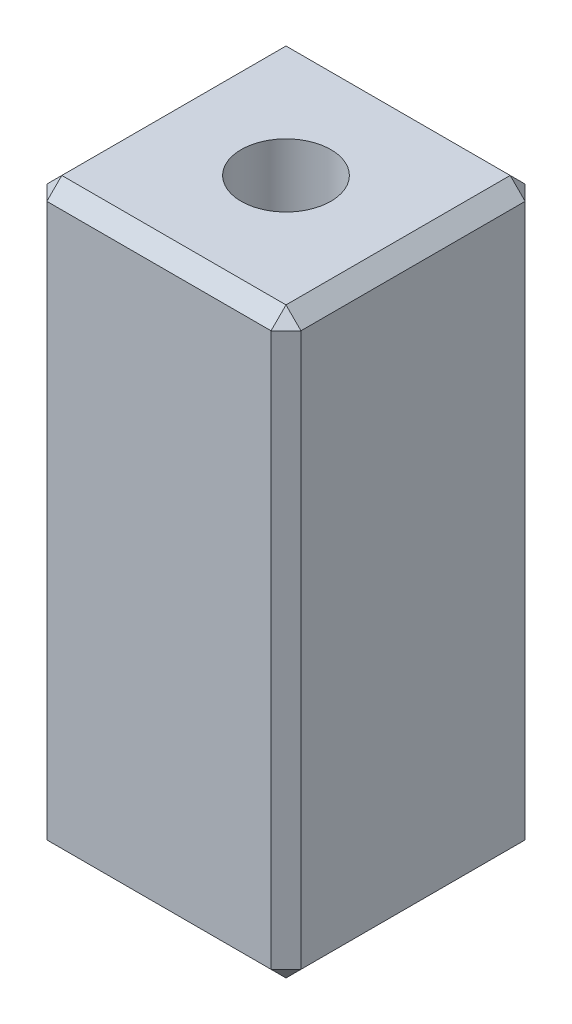
ISO-10303-21;
HEADER;
FILE_DESCRIPTION(('STEP AP214'),'2;1');
FILE_NAME('part.step','',(''),(''),'','','');
FILE_SCHEMA(('AUTOMOTIVE_DESIGN { 1 0 10303 214 1 1 1 1 }'));
ENDSEC;
DATA;
#1=APPLICATION_CONTEXT('core data for automotive mechanical design processes');
#2=APPLICATION_PROTOCOL_DEFINITION('international standard','automotive_design',2000,#1);
#3=PRODUCT_CONTEXT('',#1,'mechanical');
#4=PRODUCT('Part','Part','',(#3));
#5=PRODUCT_RELATED_PRODUCT_CATEGORY('part','',(#4));
#6=PRODUCT_DEFINITION_FORMATION('','',#4);
#7=PRODUCT_DEFINITION_CONTEXT('part definition',#1,'design');
#8=PRODUCT_DEFINITION('design','',#6,#7);
#9=PRODUCT_DEFINITION_SHAPE('','',#8);
#10=(LENGTH_UNIT() NAMED_UNIT(*) SI_UNIT(.MILLI.,.METRE.));
#11=(NAMED_UNIT(*) PLANE_ANGLE_UNIT() SI_UNIT($,.RADIAN.));
#12=(NAMED_UNIT(*) SI_UNIT($,.STERADIAN.) SOLID_ANGLE_UNIT());
#13=UNCERTAINTY_MEASURE_WITH_UNIT(LENGTH_MEASURE(1.E-05),#10,'distance_accuracy_value','');
#14=(GEOMETRIC_REPRESENTATION_CONTEXT(3) GLOBAL_UNCERTAINTY_ASSIGNED_CONTEXT((#13)) GLOBAL_UNIT_ASSIGNED_CONTEXT((#10,
#11,#12)) REPRESENTATION_CONTEXT('',''));
#15=CARTESIAN_POINT('',(0.,0.,0.));
#16=DIRECTION('',(0.,0.,1.));
#17=DIRECTION('',(1.,0.,0.));
#18=AXIS2_PLACEMENT_3D('',#15,#16,#17);
#19=CARTESIAN_POINT('',(0.,19.5,0.));
#20=DIRECTION('',(0.,1.,0.));
#21=DIRECTION('',(0.,0.,1.));
#22=AXIS2_PLACEMENT_3D('',#19,#20,#21);
#23=PLANE('',#22);
#24=DIRECTION('',(-1.,0.,0.));
#25=VECTOR('',#24,1.);
#26=CARTESIAN_POINT('',(-4.25,19.5,-3.75));
#27=LINE('',#26,#25);
#28=CARTESIAN_POINT('',(3.75,19.5,-3.75));
#29=VERTEX_POINT('',#28);
#30=CARTESIAN_POINT('',(-3.75,19.5,-3.75));
#31=VERTEX_POINT('',#30);
#32=EDGE_CURVE('E51',#29,#31,#27,.T.);
#33=ORIENTED_EDGE('',*,*,#32,.T.);
#34=DIRECTION('',(0.,0.,1.));
#35=VECTOR('',#34,1.);
#36=CARTESIAN_POINT('',(-3.75,19.5,4.25));
#37=LINE('',#36,#35);
#38=CARTESIAN_POINT('',(-3.75,19.5,3.75));
#39=VERTEX_POINT('',#38);
#40=EDGE_CURVE('E11',#31,#39,#37,.T.);
#41=ORIENTED_EDGE('',*,*,#40,.T.);
#42=DIRECTION('',(1.,0.,0.));
#43=VECTOR('',#42,1.);
#44=CARTESIAN_POINT('',(4.25,19.5,3.75));
#45=LINE('',#44,#43);
#46=CARTESIAN_POINT('',(3.75,19.5,3.75));
#47=VERTEX_POINT('',#46);
#48=EDGE_CURVE('E258',#39,#47,#45,.T.);
#49=ORIENTED_EDGE('',*,*,#48,.T.);
#50=DIRECTION('',(0.,0.,-1.));
#51=VECTOR('',#50,1.);
#52=CARTESIAN_POINT('',(3.75,19.5,-4.25));
#53=LINE('',#52,#51);
#54=EDGE_CURVE('E62',#47,#29,#53,.T.);
#55=ORIENTED_EDGE('',*,*,#54,.T.);
#56=EDGE_LOOP('',(#33,#41,#49,#55));
#57=FACE_BOUND('',#56,.T.);
#58=CARTESIAN_POINT('',(0.,19.5,0.));
#59=DIRECTION('',(0.,1.,0.));
#60=DIRECTION('',(0.,0.,1.));
#61=AXIS2_PLACEMENT_3D('',#58,#59,#60);
#62=CIRCLE('',#61,1.5);
#63=CARTESIAN_POINT('',(0.,19.5,1.5));
#64=VERTEX_POINT('',#63);
#65=EDGE_CURVE('E152',#64,#64,#62,.T.);
#66=ORIENTED_EDGE('',*,*,#65,.F.);
#67=EDGE_LOOP('',(#66));
#68=FACE_BOUND('',#67,.T.);
#69=ADVANCED_FACE('F41',(#57,#68),#23,.T.);
#70=CARTESIAN_POINT('',(0.,0.,0.));
#71=DIRECTION('',(0.,1.,0.));
#72=DIRECTION('',(0.,0.,1.));
#73=AXIS2_PLACEMENT_3D('',#70,#71,#72);
#74=PLANE('',#73);
#75=DIRECTION('',(-1.,0.,0.));
#76=VECTOR('',#75,1.);
#77=CARTESIAN_POINT('',(0.,0.,3.75));
#78=LINE('',#77,#76);
#79=CARTESIAN_POINT('',(3.75,0.,3.75));
#80=VERTEX_POINT('',#79);
#81=CARTESIAN_POINT('',(-3.75,0.,3.75));
#82=VERTEX_POINT('',#81);
#83=EDGE_CURVE('E223',#80,#82,#78,.T.);
#84=ORIENTED_EDGE('',*,*,#83,.T.);
#85=DIRECTION('',(0.,0.,-1.));
#86=VECTOR('',#85,1.);
#87=CARTESIAN_POINT('',(-3.75,0.,0.));
#88=LINE('',#87,#86);
#89=CARTESIAN_POINT('',(-3.75,0.,-3.75));
#90=VERTEX_POINT('',#89);
#91=EDGE_CURVE('E229',#82,#90,#88,.T.);
#92=ORIENTED_EDGE('',*,*,#91,.T.);
#93=DIRECTION('',(1.,0.,0.));
#94=VECTOR('',#93,1.);
#95=CARTESIAN_POINT('',(0.,0.,-3.75));
#96=LINE('',#95,#94);
#97=CARTESIAN_POINT('',(3.75,0.,-3.75));
#98=VERTEX_POINT('',#97);
#99=EDGE_CURVE('E227',#90,#98,#96,.T.);
#100=ORIENTED_EDGE('',*,*,#99,.T.);
#101=DIRECTION('',(0.,0.,1.));
#102=VECTOR('',#101,1.);
#103=CARTESIAN_POINT('',(3.75,0.,0.));
#104=LINE('',#103,#102);
#105=EDGE_CURVE('E225',#98,#80,#104,.T.);
#106=ORIENTED_EDGE('',*,*,#105,.T.);
#107=EDGE_LOOP('',(#84,#92,#100,#106));
#108=FACE_BOUND('',#107,.T.);
#109=CARTESIAN_POINT('',(0.,0.,0.));
#110=DIRECTION('',(0.,1.,0.));
#111=DIRECTION('',(0.,0.,1.));
#112=AXIS2_PLACEMENT_3D('',#109,#110,#111);
#113=CIRCLE('',#112,1.5);
#114=CARTESIAN_POINT('',(0.,0.,1.5));
#115=VERTEX_POINT('',#114);
#116=EDGE_CURVE('E210',#115,#115,#113,.T.);
#117=ORIENTED_EDGE('',*,*,#116,.T.);
#118=EDGE_LOOP('',(#117));
#119=FACE_BOUND('',#118,.T.);
#120=ADVANCED_FACE('F288',(#108,#119),#74,.F.);
#121=CARTESIAN_POINT('',(4.25,19.5,-4.25));
#122=DIRECTION('',(-1.,0.,0.));
#123=DIRECTION('',(0.,0.,1.));
#124=AXIS2_PLACEMENT_3D('',#121,#122,#123);
#125=PLANE('',#124);
#126=DIRECTION('',(0.,-1.,0.));
#127=VECTOR('',#126,1.);
#128=CARTESIAN_POINT('',(4.25,19.5,3.75));
#129=LINE('',#128,#127);
#130=CARTESIAN_POINT('',(4.25,19.,3.75));
#131=VERTEX_POINT('',#130);
#132=CARTESIAN_POINT('',(4.25,0.500000000000004,3.75));
#133=VERTEX_POINT('',#132);
#134=EDGE_CURVE('E241',#131,#133,#129,.T.);
#135=ORIENTED_EDGE('',*,*,#134,.T.);
#136=DIRECTION('',(0.,0.,-1.));
#137=VECTOR('',#136,1.);
#138=CARTESIAN_POINT('',(4.25,0.500000000000004,-4.25));
#139=LINE('',#138,#137);
#140=CARTESIAN_POINT('',(4.25,0.500000000000004,-3.75));
#141=VERTEX_POINT('',#140);
#142=EDGE_CURVE('E247',#133,#141,#139,.T.);
#143=ORIENTED_EDGE('',*,*,#142,.T.);
#144=DIRECTION('',(0.,1.,0.));
#145=VECTOR('',#144,1.);
#146=CARTESIAN_POINT('',(4.25,19.5,-3.75));
#147=LINE('',#146,#145);
#148=CARTESIAN_POINT('',(4.25,19.,-3.75));
#149=VERTEX_POINT('',#148);
#150=EDGE_CURVE('E245',#141,#149,#147,.T.);
#151=ORIENTED_EDGE('',*,*,#150,.T.);
#152=DIRECTION('',(0.,0.,1.));
#153=VECTOR('',#152,1.);
#154=CARTESIAN_POINT('',(4.25,19.,4.25));
#155=LINE('',#154,#153);
#156=EDGE_CURVE('E243',#149,#131,#155,.T.);
#157=ORIENTED_EDGE('',*,*,#156,.T.);
#158=EDGE_LOOP('',(#135,#143,#151,#157));
#159=FACE_BOUND('',#158,.T.);
#160=ADVANCED_FACE('F352',(#159),#125,.F.);
#161=CARTESIAN_POINT('',(-4.25,19.5,-4.25));
#162=DIRECTION('',(0.,0.,1.));
#163=DIRECTION('',(1.,0.,0.));
#164=AXIS2_PLACEMENT_3D('',#161,#162,#163);
#165=PLANE('',#164);
#166=DIRECTION('',(0.,-1.,0.));
#167=VECTOR('',#166,1.);
#168=CARTESIAN_POINT('',(3.75,19.5,-4.25));
#169=LINE('',#168,#167);
#170=CARTESIAN_POINT('',(3.75,19.,-4.25));
#171=VERTEX_POINT('',#170);
#172=CARTESIAN_POINT('',(3.75,0.500000000000004,-4.25));
#173=VERTEX_POINT('',#172);
#174=EDGE_CURVE('E234',#171,#173,#169,.T.);
#175=ORIENTED_EDGE('',*,*,#174,.T.);
#176=DIRECTION('',(-1.,0.,0.));
#177=VECTOR('',#176,1.);
#178=CARTESIAN_POINT('',(-4.25,0.500000000000004,-4.25));
#179=LINE('',#178,#177);
#180=CARTESIAN_POINT('',(-3.75,0.500000000000004,-4.25));
#181=VERTEX_POINT('',#180);
#182=EDGE_CURVE('E238',#173,#181,#179,.T.);
#183=ORIENTED_EDGE('',*,*,#182,.T.);
#184=DIRECTION('',(0.,1.,0.));
#185=VECTOR('',#184,1.);
#186=CARTESIAN_POINT('',(-3.75,19.5,-4.25));
#187=LINE('',#186,#185);
#188=CARTESIAN_POINT('',(-3.75,19.,-4.25));
#189=VERTEX_POINT('',#188);
#190=EDGE_CURVE('E236',#181,#189,#187,.T.);
#191=ORIENTED_EDGE('',*,*,#190,.T.);
#192=DIRECTION('',(1.,0.,0.));
#193=VECTOR('',#192,1.);
#194=CARTESIAN_POINT('',(4.25,19.,-4.25));
#195=LINE('',#194,#193);
#196=EDGE_CURVE('E232',#189,#171,#195,.T.);
#197=ORIENTED_EDGE('',*,*,#196,.T.);
#198=EDGE_LOOP('',(#175,#183,#191,#197));
#199=FACE_BOUND('',#198,.T.);
#200=ADVANCED_FACE('F317',(#199),#165,.F.);
#201=CARTESIAN_POINT('',(-4.25,19.5,-4.25));
#202=DIRECTION('',(1.,0.,0.));
#203=DIRECTION('',(0.,0.,-1.));
#204=AXIS2_PLACEMENT_3D('',#201,#202,#203);
#205=PLANE('',#204);
#206=DIRECTION('',(0.,-1.,0.));
#207=VECTOR('',#206,1.);
#208=CARTESIAN_POINT('',(-4.25,19.5,-3.75));
#209=LINE('',#208,#207);
#210=CARTESIAN_POINT('',(-4.25,19.,-3.75));
#211=VERTEX_POINT('',#210);
#212=CARTESIAN_POINT('',(-4.25,0.500000000000004,-3.75));
#213=VERTEX_POINT('',#212);
#214=EDGE_CURVE('E141',#211,#213,#209,.T.);
#215=ORIENTED_EDGE('',*,*,#214,.T.);
#216=DIRECTION('',(0.,0.,1.));
#217=VECTOR('',#216,1.);
#218=CARTESIAN_POINT('',(-4.25,0.500000000000004,-4.25));
#219=LINE('',#218,#217);
#220=CARTESIAN_POINT('',(-4.25,0.500000000000004,3.75));
#221=VERTEX_POINT('',#220);
#222=EDGE_CURVE('E137',#213,#221,#219,.T.);
#223=ORIENTED_EDGE('',*,*,#222,.T.);
#224=DIRECTION('',(0.,1.,0.));
#225=VECTOR('',#224,1.);
#226=CARTESIAN_POINT('',(-4.25,19.5,3.75));
#227=LINE('',#226,#225);
#228=CARTESIAN_POINT('',(-4.25,19.,3.75));
#229=VERTEX_POINT('',#228);
#230=EDGE_CURVE('E131',#221,#229,#227,.T.);
#231=ORIENTED_EDGE('',*,*,#230,.T.);
#232=DIRECTION('',(0.,0.,-1.));
#233=VECTOR('',#232,1.);
#234=CARTESIAN_POINT('',(-4.25,19.,-4.25));
#235=LINE('',#234,#233);
#236=EDGE_CURVE('E134',#229,#211,#235,.T.);
#237=ORIENTED_EDGE('',*,*,#236,.T.);
#238=EDGE_LOOP('',(#215,#223,#231,#237));
#239=FACE_BOUND('',#238,.T.);
#240=ADVANCED_FACE('F133',(#239),#205,.F.);
#241=CARTESIAN_POINT('',(-4.25,19.5,4.25));
#242=DIRECTION('',(0.,0.,-1.));
#243=DIRECTION('',(-1.,0.,0.));
#244=AXIS2_PLACEMENT_3D('',#241,#242,#243);
#245=PLANE('',#244);
#246=DIRECTION('',(0.,-1.,0.));
#247=VECTOR('',#246,1.);
#248=CARTESIAN_POINT('',(-3.75,19.5,4.25));
#249=LINE('',#248,#247);
#250=CARTESIAN_POINT('',(-3.75,19.,4.25));
#251=VERTEX_POINT('',#250);
#252=CARTESIAN_POINT('',(-3.75,0.500000000000004,4.25));
#253=VERTEX_POINT('',#252);
#254=EDGE_CURVE('E163',#251,#253,#249,.T.);
#255=ORIENTED_EDGE('',*,*,#254,.T.);
#256=DIRECTION('',(1.,0.,0.));
#257=VECTOR('',#256,1.);
#258=CARTESIAN_POINT('',(-4.25,0.500000000000004,4.25));
#259=LINE('',#258,#257);
#260=CARTESIAN_POINT('',(3.75,0.500000000000004,4.25));
#261=VERTEX_POINT('',#260);
#262=EDGE_CURVE('E255',#253,#261,#259,.T.);
#263=ORIENTED_EDGE('',*,*,#262,.T.);
#264=DIRECTION('',(0.,1.,0.));
#265=VECTOR('',#264,1.);
#266=CARTESIAN_POINT('',(3.75,19.5,4.25));
#267=LINE('',#266,#265);
#268=CARTESIAN_POINT('',(3.75,19.,4.25));
#269=VERTEX_POINT('',#268);
#270=EDGE_CURVE('E252',#261,#269,#267,.T.);
#271=ORIENTED_EDGE('',*,*,#270,.T.);
#272=DIRECTION('',(-1.,0.,0.));
#273=VECTOR('',#272,1.);
#274=CARTESIAN_POINT('',(-4.25,19.,4.25));
#275=LINE('',#274,#273);
#276=EDGE_CURVE('E250',#269,#251,#275,.T.);
#277=ORIENTED_EDGE('',*,*,#276,.T.);
#278=EDGE_LOOP('',(#255,#263,#271,#277));
#279=FACE_BOUND('',#278,.T.);
#280=ADVANCED_FACE('F301',(#279),#245,.F.);
#281=CARTESIAN_POINT('',(0.,19.5,0.));
#282=DIRECTION('',(0.,-1.,0.));
#283=DIRECTION('',(0.,0.,-1.));
#284=AXIS2_PLACEMENT_3D('',#281,#282,#283);
#285=CYLINDRICAL_SURFACE('',#284,1.5);
#286=ORIENTED_EDGE('',*,*,#65,.T.);
#287=EDGE_LOOP('',(#286));
#288=FACE_BOUND('',#287,.T.);
#289=ORIENTED_EDGE('',*,*,#116,.F.);
#290=EDGE_LOOP('',(#289));
#291=FACE_BOUND('',#290,.T.);
#292=ADVANCED_FACE('F355',(#288,#291),#285,.F.);
#293=CARTESIAN_POINT('',(3.75,19.5,0.));
#294=DIRECTION('',(0.707106781186547,0.707106781186547,0.));
#295=DIRECTION('',(0.,0.,1.));
#296=AXIS2_PLACEMENT_3D('',#293,#294,#295);
#297=PLANE('',#296);
#298=DIRECTION('',(0.707106781186548,-0.707106781186548,0.));
#299=VECTOR('',#298,1.);
#300=CARTESIAN_POINT('',(4.25,19.,-3.75));
#301=LINE('',#300,#299);
#302=EDGE_CURVE('E46',#29,#149,#301,.T.);
#303=ORIENTED_EDGE('',*,*,#302,.F.);
#304=ORIENTED_EDGE('',*,*,#54,.F.);
#305=DIRECTION('',(-0.707106781186547,0.707106781186547,0.));
#306=VECTOR('',#305,1.);
#307=CARTESIAN_POINT('',(4.25,19.,3.75));
#308=LINE('',#307,#306);
#309=EDGE_CURVE('E203',#131,#47,#308,.T.);
#310=ORIENTED_EDGE('',*,*,#309,.F.);
#311=ORIENTED_EDGE('',*,*,#156,.F.);
#312=EDGE_LOOP('',(#303,#304,#310,#311));
#313=FACE_BOUND('',#312,.T.);
#314=ADVANCED_FACE('F44',(#313),#297,.T.);
#315=CARTESIAN_POINT('',(4.25,19.,-3.75));
#316=DIRECTION('',(0.577350269189626,0.577350269189626,-0.577350269189626));
#317=DIRECTION('',(-0.707106781186547,0.,-0.707106781186547));
#318=AXIS2_PLACEMENT_3D('',#315,#316,#317);
#319=PLANE('',#318);
#320=DIRECTION('',(0.,0.707106781186547,0.707106781186547));
#321=VECTOR('',#320,1.);
#322=CARTESIAN_POINT('',(3.75,19.25,-4.));
#323=LINE('',#322,#321);
#324=EDGE_CURVE('E198',#29,#171,#323,.F.);
#325=ORIENTED_EDGE('',*,*,#324,.F.);
#326=ORIENTED_EDGE('',*,*,#302,.T.);
#327=DIRECTION('',(0.707106781186547,0.,0.707106781186547));
#328=VECTOR('',#327,1.);
#329=CARTESIAN_POINT('',(4.25,19.,-3.75));
#330=LINE('',#329,#328);
#331=EDGE_CURVE('E201',#171,#149,#330,.T.);
#332=ORIENTED_EDGE('',*,*,#331,.F.);
#333=EDGE_LOOP('',(#325,#326,#332));
#334=FACE_BOUND('',#333,.T.);
#335=ADVANCED_FACE('F338',(#334),#319,.T.);
#336=CARTESIAN_POINT('',(4.25,19.,3.75));
#337=DIRECTION('',(0.577350269189625,0.577350269189626,0.577350269189626));
#338=DIRECTION('',(0.,-0.707106781186547,0.707106781186547));
#339=AXIS2_PLACEMENT_3D('',#336,#337,#338);
#340=PLANE('',#339);
#341=DIRECTION('',(-0.707106781186548,0.,0.707106781186547));
#342=VECTOR('',#341,1.);
#343=CARTESIAN_POINT('',(4.25,19.,3.75));
#344=LINE('',#343,#342);
#345=EDGE_CURVE('E192',#131,#269,#344,.T.);
#346=ORIENTED_EDGE('',*,*,#345,.F.);
#347=ORIENTED_EDGE('',*,*,#309,.T.);
#348=DIRECTION('',(0.,-0.707106781186548,0.707106781186548));
#349=VECTOR('',#348,1.);
#350=CARTESIAN_POINT('',(3.75,19.25,4.));
#351=LINE('',#350,#349);
#352=EDGE_CURVE('E195',#269,#47,#351,.F.);
#353=ORIENTED_EDGE('',*,*,#352,.F.);
#354=EDGE_LOOP('',(#346,#347,#353));
#355=FACE_BOUND('',#354,.T.);
#356=ADVANCED_FACE('F336',(#355),#340,.T.);
#357=CARTESIAN_POINT('',(3.75,19.5,-4.25));
#358=DIRECTION('',(-0.707106781186547,0.,0.707106781186547));
#359=DIRECTION('',(0.,-1.,0.));
#360=AXIS2_PLACEMENT_3D('',#357,#358,#359);
#361=PLANE('',#360);
#362=ORIENTED_EDGE('',*,*,#331,.T.);
#363=ORIENTED_EDGE('',*,*,#150,.F.);
#364=DIRECTION('',(-0.707106781186547,0.,-0.707106781186547));
#365=VECTOR('',#364,1.);
#366=CARTESIAN_POINT('',(4.,0.500000000000004,-4.));
#367=LINE('',#366,#365);
#368=EDGE_CURVE('E187',#173,#141,#367,.F.);
#369=ORIENTED_EDGE('',*,*,#368,.F.);
#370=ORIENTED_EDGE('',*,*,#174,.F.);
#371=EDGE_LOOP('',(#362,#363,#369,#370));
#372=FACE_BOUND('',#371,.T.);
#373=ADVANCED_FACE('F322',(#372),#361,.F.);
#374=CARTESIAN_POINT('',(0.,19.5,-3.75));
#375=DIRECTION('',(0.,0.707106781186547,-0.707106781186547));
#376=DIRECTION('',(1.,0.,0.));
#377=AXIS2_PLACEMENT_3D('',#374,#375,#376);
#378=PLANE('',#377);
#379=ORIENTED_EDGE('',*,*,#324,.T.);
#380=ORIENTED_EDGE('',*,*,#196,.F.);
#381=DIRECTION('',(0.,-0.707106781186547,-0.707106781186547));
#382=VECTOR('',#381,1.);
#383=CARTESIAN_POINT('',(-3.75,19.,-4.25));
#384=LINE('',#383,#382);
#385=EDGE_CURVE('E184',#31,#189,#384,.T.);
#386=ORIENTED_EDGE('',*,*,#385,.F.);
#387=ORIENTED_EDGE('',*,*,#32,.F.);
#388=EDGE_LOOP('',(#379,#380,#386,#387));
#389=FACE_BOUND('',#388,.T.);
#390=ADVANCED_FACE('F310',(#389),#378,.T.);
#391=CARTESIAN_POINT('',(-3.75,19.5,0.));
#392=DIRECTION('',(-0.707106781186547,0.707106781186547,0.));
#393=DIRECTION('',(0.,0.,-1.));
#394=AXIS2_PLACEMENT_3D('',#391,#392,#393);
#395=PLANE('',#394);
#396=DIRECTION('',(-0.707106781186548,-0.707106781186548,0.));
#397=VECTOR('',#396,1.);
#398=CARTESIAN_POINT('',(-4.25,19.,3.75));
#399=LINE('',#398,#397);
#400=EDGE_CURVE('E147',#39,#229,#399,.T.);
#401=ORIENTED_EDGE('',*,*,#400,.F.);
#402=ORIENTED_EDGE('',*,*,#40,.F.);
#403=DIRECTION('',(0.707106781186547,0.707106781186547,0.));
#404=VECTOR('',#403,1.);
#405=CARTESIAN_POINT('',(-4.,19.25,-3.75));
#406=LINE('',#405,#404);
#407=EDGE_CURVE('E150',#211,#31,#406,.T.);
#408=ORIENTED_EDGE('',*,*,#407,.F.);
#409=ORIENTED_EDGE('',*,*,#236,.F.);
#410=EDGE_LOOP('',(#401,#402,#408,#409));
#411=FACE_BOUND('',#410,.T.);
#412=ADVANCED_FACE('F146',(#411),#395,.T.);
#413=CARTESIAN_POINT('',(0.,19.5,3.75));
#414=DIRECTION('',(0.,0.707106781186547,0.707106781186547));
#415=DIRECTION('',(-1.,0.,0.));
#416=AXIS2_PLACEMENT_3D('',#413,#414,#415);
#417=PLANE('',#416);
#418=ORIENTED_EDGE('',*,*,#352,.T.);
#419=ORIENTED_EDGE('',*,*,#48,.F.);
#420=DIRECTION('',(0.,0.707106781186548,-0.707106781186548));
#421=VECTOR('',#420,1.);
#422=CARTESIAN_POINT('',(-3.75,19.25,4.));
#423=LINE('',#422,#421);
#424=EDGE_CURVE('E160',#251,#39,#423,.T.);
#425=ORIENTED_EDGE('',*,*,#424,.F.);
#426=ORIENTED_EDGE('',*,*,#276,.F.);
#427=EDGE_LOOP('',(#418,#419,#425,#426));
#428=FACE_BOUND('',#427,.T.);
#429=ADVANCED_FACE('F305',(#428),#417,.T.);
#430=CARTESIAN_POINT('',(4.25,19.5,3.75));
#431=DIRECTION('',(-0.707106781186547,0.,-0.707106781186548));
#432=DIRECTION('',(0.,-1.,0.));
#433=AXIS2_PLACEMENT_3D('',#430,#431,#432);
#434=PLANE('',#433);
#435=ORIENTED_EDGE('',*,*,#345,.T.);
#436=ORIENTED_EDGE('',*,*,#270,.F.);
#437=DIRECTION('',(0.707106781186548,0.,-0.707106781186547));
#438=VECTOR('',#437,1.);
#439=CARTESIAN_POINT('',(4.,0.500000000000004,4.));
#440=LINE('',#439,#438);
#441=EDGE_CURVE('E179',#133,#261,#440,.F.);
#442=ORIENTED_EDGE('',*,*,#441,.F.);
#443=ORIENTED_EDGE('',*,*,#134,.F.);
#444=EDGE_LOOP('',(#435,#436,#442,#443));
#445=FACE_BOUND('',#444,.T.);
#446=ADVANCED_FACE('F335',(#445),#434,.F.);
#447=CARTESIAN_POINT('',(4.25,0.500000000000004,-4.25));
#448=DIRECTION('',(-0.707106781186547,0.707106781186547,0.));
#449=DIRECTION('',(0.,0.,-1.));
#450=AXIS2_PLACEMENT_3D('',#447,#448,#449);
#451=PLANE('',#450);
#452=DIRECTION('',(0.707106781186548,0.707106781186548,0.));
#453=VECTOR('',#452,1.);
#454=CARTESIAN_POINT('',(3.75,0.,-3.75));
#455=LINE('',#454,#453);
#456=EDGE_CURVE('E189',#141,#98,#455,.F.);
#457=ORIENTED_EDGE('',*,*,#456,.F.);
#458=ORIENTED_EDGE('',*,*,#142,.F.);
#459=DIRECTION('',(-0.707106781186547,-0.707106781186547,0.));
#460=VECTOR('',#459,1.);
#461=CARTESIAN_POINT('',(3.75,0.,3.75));
#462=LINE('',#461,#460);
#463=EDGE_CURVE('E176',#80,#133,#462,.F.);
#464=ORIENTED_EDGE('',*,*,#463,.F.);
#465=ORIENTED_EDGE('',*,*,#105,.F.);
#466=EDGE_LOOP('',(#457,#458,#464,#465));
#467=FACE_BOUND('',#466,.T.);
#468=ADVANCED_FACE('F328',(#467),#451,.F.);
#469=CARTESIAN_POINT('',(3.75,0.,-3.75));
#470=DIRECTION('',(0.577350269189626,-0.577350269189626,-0.577350269189626));
#471=DIRECTION('',(-0.707106781186547,0.,-0.707106781186547));
#472=AXIS2_PLACEMENT_3D('',#469,#470,#471);
#473=PLANE('',#472);
#474=ORIENTED_EDGE('',*,*,#368,.T.);
#475=ORIENTED_EDGE('',*,*,#456,.T.);
#476=DIRECTION('',(0.,-0.707106781186547,0.707106781186547));
#477=VECTOR('',#476,1.);
#478=CARTESIAN_POINT('',(3.75,0.,-3.75));
#479=LINE('',#478,#477);
#480=EDGE_CURVE('E168',#173,#98,#479,.T.);
#481=ORIENTED_EDGE('',*,*,#480,.F.);
#482=EDGE_LOOP('',(#474,#475,#481));
#483=FACE_BOUND('',#482,.T.);
#484=ADVANCED_FACE('F325',(#483),#473,.T.);
#485=CARTESIAN_POINT('',(-3.75,19.,-4.25));
#486=DIRECTION('',(-0.577350269189626,0.577350269189626,-0.577350269189626));
#487=DIRECTION('',(-0.707106781186547,0.,0.707106781186547));
#488=AXIS2_PLACEMENT_3D('',#485,#486,#487);
#489=PLANE('',#488);
#490=ORIENTED_EDGE('',*,*,#407,.T.);
#491=ORIENTED_EDGE('',*,*,#385,.T.);
#492=DIRECTION('',(0.707106781186547,0.,-0.707106781186547));
#493=VECTOR('',#492,1.);
#494=CARTESIAN_POINT('',(-3.75,19.,-4.25));
#495=LINE('',#494,#493);
#496=EDGE_CURVE('E164',#211,#189,#495,.T.);
#497=ORIENTED_EDGE('',*,*,#496,.F.);
#498=EDGE_LOOP('',(#490,#491,#497));
#499=FACE_BOUND('',#498,.T.);
#500=ADVANCED_FACE('F312',(#499),#489,.T.);
#501=CARTESIAN_POINT('',(-4.25,19.,3.75));
#502=DIRECTION('',(-0.577350269189625,0.577350269189626,0.577350269189626));
#503=DIRECTION('',(0.,-0.707106781186547,0.707106781186547));
#504=AXIS2_PLACEMENT_3D('',#501,#502,#503);
#505=PLANE('',#504);
#506=ORIENTED_EDGE('',*,*,#424,.T.);
#507=ORIENTED_EDGE('',*,*,#400,.T.);
#508=DIRECTION('',(-0.707106781186548,0.,-0.707106781186547));
#509=VECTOR('',#508,1.);
#510=CARTESIAN_POINT('',(-4.25,19.,3.75));
#511=LINE('',#510,#509);
#512=EDGE_CURVE('E157',#251,#229,#511,.T.);
#513=ORIENTED_EDGE('',*,*,#512,.F.);
#514=EDGE_LOOP('',(#506,#507,#513));
#515=FACE_BOUND('',#514,.T.);
#516=ADVANCED_FACE('F156',(#515),#505,.T.);
#517=CARTESIAN_POINT('',(3.75,0.,3.75));
#518=DIRECTION('',(0.577350269189625,-0.577350269189626,0.577350269189626));
#519=DIRECTION('',(0.,-0.707106781186547,-0.707106781186547));
#520=AXIS2_PLACEMENT_3D('',#517,#518,#519);
#521=PLANE('',#520);
#522=ORIENTED_EDGE('',*,*,#463,.T.);
#523=ORIENTED_EDGE('',*,*,#441,.T.);
#524=DIRECTION('',(0.,0.707106781186548,0.707106781186548));
#525=VECTOR('',#524,1.);
#526=CARTESIAN_POINT('',(3.75,0.,3.75));
#527=LINE('',#526,#525);
#528=EDGE_CURVE('E165',#80,#261,#527,.T.);
#529=ORIENTED_EDGE('',*,*,#528,.F.);
#530=EDGE_LOOP('',(#522,#523,#529));
#531=FACE_BOUND('',#530,.T.);
#532=ADVANCED_FACE('F332',(#531),#521,.T.);
#533=CARTESIAN_POINT('',(-4.25,0.500000000000004,-4.25));
#534=DIRECTION('',(0.,0.707106781186547,0.707106781186547));
#535=DIRECTION('',(-1.,0.,0.));
#536=AXIS2_PLACEMENT_3D('',#533,#534,#535);
#537=PLANE('',#536);
#538=ORIENTED_EDGE('',*,*,#480,.T.);
#539=ORIENTED_EDGE('',*,*,#99,.F.);
#540=DIRECTION('',(0.,0.707106781186547,-0.707106781186547));
#541=VECTOR('',#540,1.);
#542=CARTESIAN_POINT('',(-3.75,0.,-3.75));
#543=LINE('',#542,#541);
#544=EDGE_CURVE('E170',#181,#90,#543,.F.);
#545=ORIENTED_EDGE('',*,*,#544,.F.);
#546=ORIENTED_EDGE('',*,*,#182,.F.);
#547=EDGE_LOOP('',(#538,#539,#545,#546));
#548=FACE_BOUND('',#547,.T.);
#549=ADVANCED_FACE('F283',(#548),#537,.F.);
#550=CARTESIAN_POINT('',(-4.25,19.5,-3.75));
#551=DIRECTION('',(0.707106781186547,0.,0.707106781186547));
#552=DIRECTION('',(0.,-1.,0.));
#553=AXIS2_PLACEMENT_3D('',#550,#551,#552);
#554=PLANE('',#553);
#555=ORIENTED_EDGE('',*,*,#496,.T.);
#556=ORIENTED_EDGE('',*,*,#190,.F.);
#557=DIRECTION('',(-0.707106781186547,0.,0.707106781186547));
#558=VECTOR('',#557,1.);
#559=CARTESIAN_POINT('',(-4.,0.500000000000004,-4.));
#560=LINE('',#559,#558);
#561=EDGE_CURVE('E272',#213,#181,#560,.F.);
#562=ORIENTED_EDGE('',*,*,#561,.F.);
#563=ORIENTED_EDGE('',*,*,#214,.F.);
#564=EDGE_LOOP('',(#555,#556,#562,#563));
#565=FACE_BOUND('',#564,.T.);
#566=ADVANCED_FACE('F315',(#565),#554,.F.);
#567=CARTESIAN_POINT('',(-3.75,19.5,4.25));
#568=DIRECTION('',(0.707106781186547,0.,-0.707106781186548));
#569=DIRECTION('',(0.,-1.,0.));
#570=AXIS2_PLACEMENT_3D('',#567,#568,#569);
#571=PLANE('',#570);
#572=ORIENTED_EDGE('',*,*,#512,.T.);
#573=ORIENTED_EDGE('',*,*,#230,.F.);
#574=DIRECTION('',(0.707106781186548,0.,0.707106781186547));
#575=VECTOR('',#574,1.);
#576=CARTESIAN_POINT('',(-4.25,0.500000000000004,3.75));
#577=LINE('',#576,#575);
#578=EDGE_CURVE('E269',#253,#221,#577,.F.);
#579=ORIENTED_EDGE('',*,*,#578,.F.);
#580=ORIENTED_EDGE('',*,*,#254,.F.);
#581=EDGE_LOOP('',(#572,#573,#579,#580));
#582=FACE_BOUND('',#581,.T.);
#583=ADVANCED_FACE('F162',(#582),#571,.F.);
#584=CARTESIAN_POINT('',(-4.25,0.500000000000004,4.25));
#585=DIRECTION('',(0.,0.707106781186547,-0.707106781186547));
#586=DIRECTION('',(1.,0.,0.));
#587=AXIS2_PLACEMENT_3D('',#584,#585,#586);
#588=PLANE('',#587);
#589=ORIENTED_EDGE('',*,*,#528,.T.);
#590=ORIENTED_EDGE('',*,*,#262,.F.);
#591=DIRECTION('',(0.,-0.707106781186548,-0.707106781186548));
#592=VECTOR('',#591,1.);
#593=CARTESIAN_POINT('',(-3.75,0.250000000000002,4.));
#594=LINE('',#593,#592);
#595=EDGE_CURVE('E266',#82,#253,#594,.F.);
#596=ORIENTED_EDGE('',*,*,#595,.F.);
#597=ORIENTED_EDGE('',*,*,#83,.F.);
#598=EDGE_LOOP('',(#589,#590,#596,#597));
#599=FACE_BOUND('',#598,.T.);
#600=ADVANCED_FACE('F298',(#599),#588,.F.);
#601=CARTESIAN_POINT('',(-3.75,0.,-3.75));
#602=DIRECTION('',(-0.577350269189626,-0.577350269189626,-0.577350269189626));
#603=DIRECTION('',(-0.707106781186547,0.,0.707106781186547));
#604=AXIS2_PLACEMENT_3D('',#601,#602,#603);
#605=PLANE('',#604);
#606=ORIENTED_EDGE('',*,*,#561,.T.);
#607=ORIENTED_EDGE('',*,*,#544,.T.);
#608=DIRECTION('',(0.707106781186547,-0.707106781186547,0.));
#609=VECTOR('',#608,1.);
#610=CARTESIAN_POINT('',(-3.75,0.,-3.75));
#611=LINE('',#610,#609);
#612=EDGE_CURVE('E264',#213,#90,#611,.T.);
#613=ORIENTED_EDGE('',*,*,#612,.F.);
#614=EDGE_LOOP('',(#606,#607,#613));
#615=FACE_BOUND('',#614,.T.);
#616=ADVANCED_FACE('F278',(#615),#605,.T.);
#617=CARTESIAN_POINT('',(-4.25,0.500000000000004,3.75));
#618=DIRECTION('',(-0.577350269189625,-0.577350269189626,0.577350269189626));
#619=DIRECTION('',(0.,-0.707106781186547,-0.707106781186547));
#620=AXIS2_PLACEMENT_3D('',#617,#618,#619);
#621=PLANE('',#620);
#622=ORIENTED_EDGE('',*,*,#595,.T.);
#623=ORIENTED_EDGE('',*,*,#578,.T.);
#624=DIRECTION('',(-0.707106781186548,0.707106781186548,0.));
#625=VECTOR('',#624,1.);
#626=CARTESIAN_POINT('',(-4.25,0.500000000000004,3.75));
#627=LINE('',#626,#625);
#628=EDGE_CURVE('E262',#82,#221,#627,.T.);
#629=ORIENTED_EDGE('',*,*,#628,.F.);
#630=EDGE_LOOP('',(#622,#623,#629));
#631=FACE_BOUND('',#630,.T.);
#632=ADVANCED_FACE('F295',(#631),#621,.T.);
#633=CARTESIAN_POINT('',(-4.25,0.500000000000004,-4.25));
#634=DIRECTION('',(0.707106781186547,0.707106781186547,0.));
#635=DIRECTION('',(0.,0.,1.));
#636=AXIS2_PLACEMENT_3D('',#633,#634,#635);
#637=PLANE('',#636);
#638=ORIENTED_EDGE('',*,*,#612,.T.);
#639=ORIENTED_EDGE('',*,*,#91,.F.);
#640=ORIENTED_EDGE('',*,*,#628,.T.);
#641=ORIENTED_EDGE('',*,*,#222,.F.);
#642=EDGE_LOOP('',(#638,#639,#640,#641));
#643=FACE_BOUND('',#642,.T.);
#644=ADVANCED_FACE('F293',(#643),#637,.F.);
#645=CLOSED_SHELL('',(#69,#120,#160,#200,#240,#280,#292,#314,#335,#356,#373,#390,#412,#429,#446,
#468,#484,#500,#516,#532,#549,#566,#583,#600,#616,#632,#644));
#646=MANIFOLD_SOLID_BREP('B2',#645);
#647=ADVANCED_BREP_SHAPE_REPRESENTATION('',(#18,#646),#14);
#648=SHAPE_DEFINITION_REPRESENTATION(#9,#647);
ENDSEC;
END-ISO-10303-21;
